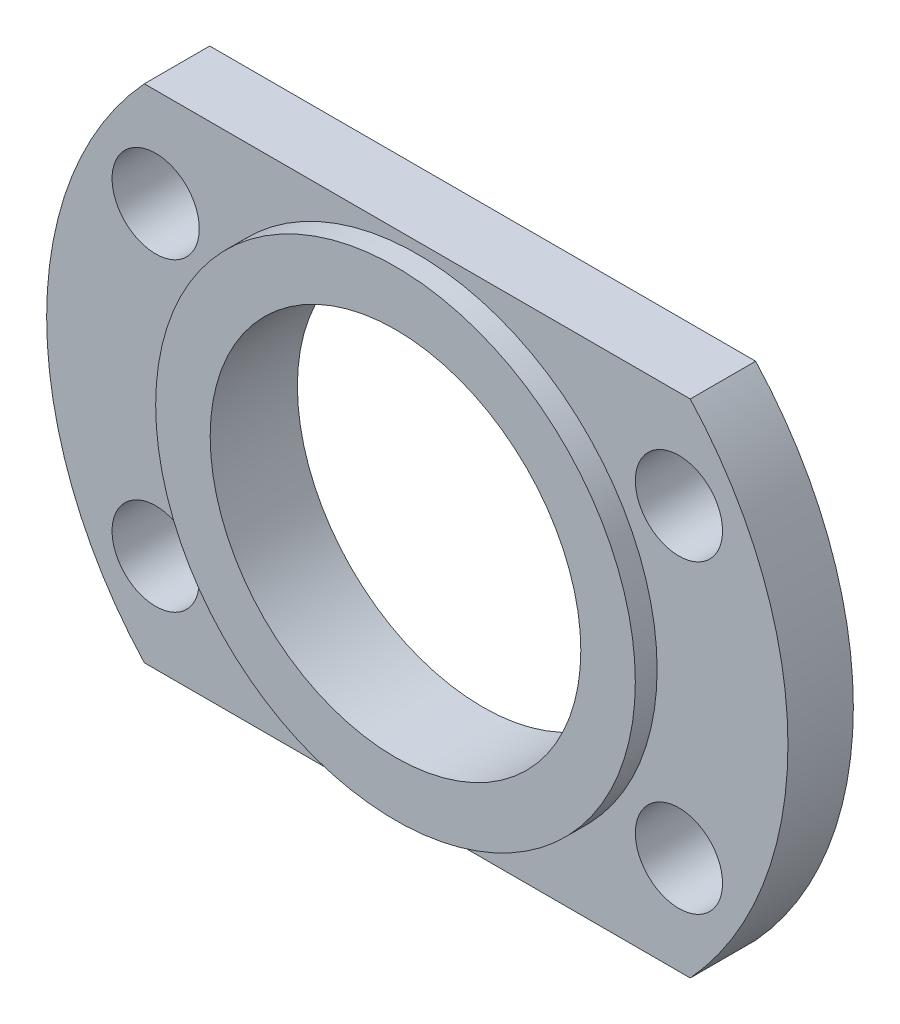
ISO-10303-21;
HEADER;
FILE_DESCRIPTION(('STEP AP214'),'2;1');
FILE_NAME('part.step','',(''),(''),'','','');
FILE_SCHEMA(('AUTOMOTIVE_DESIGN { 1 0 10303 214 1 1 1 1 }'));
ENDSEC;
DATA;
#1=APPLICATION_CONTEXT('core data for automotive mechanical design processes');
#2=APPLICATION_PROTOCOL_DEFINITION('international standard','automotive_design',2000,#1);
#3=PRODUCT_CONTEXT('',#1,'mechanical');
#4=PRODUCT('Part','Part','',(#3));
#5=PRODUCT_RELATED_PRODUCT_CATEGORY('part','',(#4));
#6=PRODUCT_DEFINITION_FORMATION('','',#4);
#7=PRODUCT_DEFINITION_CONTEXT('part definition',#1,'design');
#8=PRODUCT_DEFINITION('design','',#6,#7);
#9=PRODUCT_DEFINITION_SHAPE('','',#8);
#10=(LENGTH_UNIT() NAMED_UNIT(*) SI_UNIT(.MILLI.,.METRE.));
#11=(NAMED_UNIT(*) PLANE_ANGLE_UNIT() SI_UNIT($,.RADIAN.));
#12=(NAMED_UNIT(*) SI_UNIT($,.STERADIAN.) SOLID_ANGLE_UNIT());
#13=UNCERTAINTY_MEASURE_WITH_UNIT(LENGTH_MEASURE(1.E-05),#10,'distance_accuracy_value','');
#14=(GEOMETRIC_REPRESENTATION_CONTEXT(3) GLOBAL_UNCERTAINTY_ASSIGNED_CONTEXT((#13)) GLOBAL_UNIT_ASSIGNED_CONTEXT((#10,
#11,#12)) REPRESENTATION_CONTEXT('',''));
#15=CARTESIAN_POINT('',(0.,0.,0.));
#16=DIRECTION('',(0.,0.,1.));
#17=DIRECTION('',(1.,0.,0.));
#18=AXIS2_PLACEMENT_3D('',#15,#16,#17);
#19=CARTESIAN_POINT('',(0.,0.,3.));
#20=DIRECTION('',(0.,0.,1.));
#21=DIRECTION('',(1.,0.,0.));
#22=AXIS2_PLACEMENT_3D('',#19,#20,#21);
#23=PLANE('',#22);
#24=CARTESIAN_POINT('',(12.,7.,3.));
#25=DIRECTION('',(0.,0.,1.));
#26=DIRECTION('',(1.,0.,0.));
#27=AXIS2_PLACEMENT_3D('',#24,#25,#26);
#28=CIRCLE('',#27,2.);
#29=CARTESIAN_POINT('',(14.,7.,3.));
#30=VERTEX_POINT('',#29);
#31=EDGE_CURVE('E122',#30,#30,#28,.T.);
#32=ORIENTED_EDGE('',*,*,#31,.F.);
#33=EDGE_LOOP('',(#32));
#34=FACE_BOUND('',#33,.T.);
#35=CARTESIAN_POINT('',(-12.,-7.,3.));
#36=DIRECTION('',(0.,0.,1.));
#37=DIRECTION('',(1.,0.,0.));
#38=AXIS2_PLACEMENT_3D('',#35,#36,#37);
#39=CIRCLE('',#38,2.);
#40=CARTESIAN_POINT('',(-10.,-7.,3.));
#41=VERTEX_POINT('',#40);
#42=EDGE_CURVE('E101',#41,#41,#39,.T.);
#43=ORIENTED_EDGE('',*,*,#42,.F.);
#44=EDGE_LOOP('',(#43));
#45=FACE_BOUND('',#44,.T.);
#46=CARTESIAN_POINT('',(0.,0.,3.));
#47=DIRECTION('',(0.,0.,1.));
#48=DIRECTION('',(1.,0.,0.));
#49=AXIS2_PLACEMENT_3D('',#46,#47,#48);
#50=CIRCLE('',#49,17.);
#51=CARTESIAN_POINT('',(-12.5199840255489,11.5,3.));
#52=VERTEX_POINT('',#51);
#53=CARTESIAN_POINT('',(-12.5199840255489,-11.5,3.));
#54=VERTEX_POINT('',#53);
#55=EDGE_CURVE('E86',#52,#54,#50,.T.);
#56=ORIENTED_EDGE('',*,*,#55,.T.);
#57=DIRECTION('',(1.,0.,0.));
#58=VECTOR('',#57,1.);
#59=CARTESIAN_POINT('',(-12.5199840255489,-11.5,3.));
#60=LINE('',#59,#58);
#61=CARTESIAN_POINT('',(12.5199840255489,-11.5,3.));
#62=VERTEX_POINT('',#61);
#63=EDGE_CURVE('E81',#54,#62,#60,.T.);
#64=ORIENTED_EDGE('',*,*,#63,.T.);
#65=CARTESIAN_POINT('',(0.,0.,3.));
#66=DIRECTION('',(0.,0.,1.));
#67=DIRECTION('',(1.,0.,0.));
#68=AXIS2_PLACEMENT_3D('',#65,#66,#67);
#69=CIRCLE('',#68,17.);
#70=CARTESIAN_POINT('',(12.5199840255489,11.5,3.));
#71=VERTEX_POINT('',#70);
#72=EDGE_CURVE('E84',#62,#71,#69,.T.);
#73=ORIENTED_EDGE('',*,*,#72,.T.);
#74=DIRECTION('',(-1.,0.,0.));
#75=VECTOR('',#74,1.);
#76=CARTESIAN_POINT('',(-12.5199840255489,11.5,3.));
#77=LINE('',#76,#75);
#78=EDGE_CURVE('E51',#71,#52,#77,.T.);
#79=ORIENTED_EDGE('',*,*,#78,.T.);
#80=EDGE_LOOP('',(#56,#64,#73,#79));
#81=FACE_BOUND('',#80,.T.);
#82=CARTESIAN_POINT('',(-12.,7.,3.));
#83=DIRECTION('',(0.,0.,1.));
#84=DIRECTION('',(1.,0.,0.));
#85=AXIS2_PLACEMENT_3D('',#82,#83,#84);
#86=CIRCLE('',#85,2.);
#87=CARTESIAN_POINT('',(-10.,7.,3.));
#88=VERTEX_POINT('',#87);
#89=EDGE_CURVE('E116',#88,#88,#86,.T.);
#90=ORIENTED_EDGE('',*,*,#89,.F.);
#91=EDGE_LOOP('',(#90));
#92=FACE_BOUND('',#91,.T.);
#93=CARTESIAN_POINT('',(12.,-7.,3.));
#94=DIRECTION('',(0.,0.,1.));
#95=DIRECTION('',(1.,0.,0.));
#96=AXIS2_PLACEMENT_3D('',#93,#94,#95);
#97=CIRCLE('',#96,2.);
#98=CARTESIAN_POINT('',(14.,-7.,3.));
#99=VERTEX_POINT('',#98);
#100=EDGE_CURVE('E128',#99,#99,#97,.T.);
#101=ORIENTED_EDGE('',*,*,#100,.F.);
#102=EDGE_LOOP('',(#101));
#103=FACE_BOUND('',#102,.T.);
#104=CARTESIAN_POINT('',(0.,0.,3.));
#105=DIRECTION('',(0.,0.,1.));
#106=DIRECTION('',(1.,0.,0.));
#107=AXIS2_PLACEMENT_3D('',#104,#105,#106);
#108=CIRCLE('',#107,11.);
#109=CARTESIAN_POINT('',(11.,0.,3.));
#110=VERTEX_POINT('',#109);
#111=EDGE_CURVE('E140',#110,#110,#108,.T.);
#112=ORIENTED_EDGE('',*,*,#111,.F.);
#113=EDGE_LOOP('',(#112));
#114=FACE_BOUND('',#113,.T.);
#115=ADVANCED_FACE('F34',(#34,#45,#81,#92,#103,#114),#23,.T.);
#116=CARTESIAN_POINT('',(0.,0.,0.));
#117=DIRECTION('',(0.,0.,1.));
#118=DIRECTION('',(1.,0.,0.));
#119=AXIS2_PLACEMENT_3D('',#116,#117,#118);
#120=PLANE('',#119);
#121=CARTESIAN_POINT('',(12.,-7.,0.));
#122=DIRECTION('',(0.,0.,1.));
#123=DIRECTION('',(1.,0.,0.));
#124=AXIS2_PLACEMENT_3D('',#121,#122,#123);
#125=CIRCLE('',#124,2.);
#126=CARTESIAN_POINT('',(14.,-7.,0.));
#127=VERTEX_POINT('',#126);
#128=EDGE_CURVE('E131',#127,#127,#125,.T.);
#129=ORIENTED_EDGE('',*,*,#128,.T.);
#130=EDGE_LOOP('',(#129));
#131=FACE_BOUND('',#130,.T.);
#132=CARTESIAN_POINT('',(-12.,7.,0.));
#133=DIRECTION('',(0.,0.,1.));
#134=DIRECTION('',(1.,0.,0.));
#135=AXIS2_PLACEMENT_3D('',#132,#133,#134);
#136=CIRCLE('',#135,2.);
#137=CARTESIAN_POINT('',(-10.,7.,0.));
#138=VERTEX_POINT('',#137);
#139=EDGE_CURVE('E119',#138,#138,#136,.T.);
#140=ORIENTED_EDGE('',*,*,#139,.T.);
#141=EDGE_LOOP('',(#140));
#142=FACE_BOUND('',#141,.T.);
#143=CARTESIAN_POINT('',(0.,0.,0.));
#144=DIRECTION('',(0.,0.,1.));
#145=DIRECTION('',(1.,0.,0.));
#146=AXIS2_PLACEMENT_3D('',#143,#144,#145);
#147=CIRCLE('',#146,17.);
#148=CARTESIAN_POINT('',(-12.5199840255489,11.5,0.));
#149=VERTEX_POINT('',#148);
#150=CARTESIAN_POINT('',(-12.5199840255489,-11.5,0.));
#151=VERTEX_POINT('',#150);
#152=EDGE_CURVE('E98',#149,#151,#147,.T.);
#153=ORIENTED_EDGE('',*,*,#152,.F.);
#154=DIRECTION('',(-1.,0.,0.));
#155=VECTOR('',#154,1.);
#156=CARTESIAN_POINT('',(-12.5199840255489,11.5,0.));
#157=LINE('',#156,#155);
#158=CARTESIAN_POINT('',(12.5199840255489,11.5,0.));
#159=VERTEX_POINT('',#158);
#160=EDGE_CURVE('E74',#159,#149,#157,.T.);
#161=ORIENTED_EDGE('',*,*,#160,.F.);
#162=CARTESIAN_POINT('',(0.,0.,0.));
#163=DIRECTION('',(0.,0.,1.));
#164=DIRECTION('',(1.,0.,0.));
#165=AXIS2_PLACEMENT_3D('',#162,#163,#164);
#166=CIRCLE('',#165,17.);
#167=CARTESIAN_POINT('',(12.5199840255489,-11.5,0.));
#168=VERTEX_POINT('',#167);
#169=EDGE_CURVE('E68',#168,#159,#166,.T.);
#170=ORIENTED_EDGE('',*,*,#169,.F.);
#171=DIRECTION('',(1.,0.,0.));
#172=VECTOR('',#171,1.);
#173=CARTESIAN_POINT('',(-12.5199840255489,-11.5,0.));
#174=LINE('',#173,#172);
#175=EDGE_CURVE('E90',#151,#168,#174,.T.);
#176=ORIENTED_EDGE('',*,*,#175,.F.);
#177=EDGE_LOOP('',(#153,#161,#170,#176));
#178=FACE_BOUND('',#177,.T.);
#179=CARTESIAN_POINT('',(-12.,-7.,0.));
#180=DIRECTION('',(0.,0.,1.));
#181=DIRECTION('',(1.,0.,0.));
#182=AXIS2_PLACEMENT_3D('',#179,#180,#181);
#183=CIRCLE('',#182,2.);
#184=CARTESIAN_POINT('',(-10.,-7.,0.));
#185=VERTEX_POINT('',#184);
#186=EDGE_CURVE('E113',#185,#185,#183,.T.);
#187=ORIENTED_EDGE('',*,*,#186,.T.);
#188=EDGE_LOOP('',(#187));
#189=FACE_BOUND('',#188,.T.);
#190=CARTESIAN_POINT('',(12.,7.,0.));
#191=DIRECTION('',(0.,0.,1.));
#192=DIRECTION('',(1.,0.,0.));
#193=AXIS2_PLACEMENT_3D('',#190,#191,#192);
#194=CIRCLE('',#193,2.);
#195=CARTESIAN_POINT('',(14.,7.,0.));
#196=VERTEX_POINT('',#195);
#197=EDGE_CURVE('E125',#196,#196,#194,.T.);
#198=ORIENTED_EDGE('',*,*,#197,.T.);
#199=EDGE_LOOP('',(#198));
#200=FACE_BOUND('',#199,.T.);
#201=CARTESIAN_POINT('',(0.,0.,0.));
#202=DIRECTION('',(0.,0.,1.));
#203=DIRECTION('',(1.,0.,0.));
#204=AXIS2_PLACEMENT_3D('',#201,#202,#203);
#205=CIRCLE('',#204,8.5);
#206=CARTESIAN_POINT('',(8.5,0.,0.));
#207=VERTEX_POINT('',#206);
#208=EDGE_CURVE('E134',#207,#207,#205,.T.);
#209=ORIENTED_EDGE('',*,*,#208,.T.);
#210=EDGE_LOOP('',(#209));
#211=FACE_BOUND('',#210,.T.);
#212=ADVANCED_FACE('F109',(#131,#142,#178,#189,#200,#211),#120,.F.);
#213=CARTESIAN_POINT('',(0.,0.,3.));
#214=DIRECTION('',(0.,0.,-1.));
#215=DIRECTION('',(-1.,0.,0.));
#216=AXIS2_PLACEMENT_3D('',#213,#214,#215);
#217=CYLINDRICAL_SURFACE('',#216,17.);
#218=ORIENTED_EDGE('',*,*,#152,.T.);
#219=DIRECTION('',(0.,0.,-1.));
#220=VECTOR('',#219,1.);
#221=CARTESIAN_POINT('',(-12.5199840255489,-11.5,3.));
#222=LINE('',#221,#220);
#223=EDGE_CURVE('E11',#54,#151,#222,.T.);
#224=ORIENTED_EDGE('',*,*,#223,.F.);
#225=ORIENTED_EDGE('',*,*,#55,.F.);
#226=DIRECTION('',(0.,0.,-1.));
#227=VECTOR('',#226,1.);
#228=CARTESIAN_POINT('',(-12.5199840255489,11.5,3.));
#229=LINE('',#228,#227);
#230=EDGE_CURVE('E94',#52,#149,#229,.T.);
#231=ORIENTED_EDGE('',*,*,#230,.T.);
#232=EDGE_LOOP('',(#218,#224,#225,#231));
#233=FACE_BOUND('',#232,.T.);
#234=ADVANCED_FACE('F36',(#233),#217,.T.);
#235=CARTESIAN_POINT('',(-12.5199840255489,-11.5,3.));
#236=DIRECTION('',(0.,1.,0.));
#237=DIRECTION('',(0.,0.,1.));
#238=AXIS2_PLACEMENT_3D('',#235,#236,#237);
#239=PLANE('',#238);
#240=ORIENTED_EDGE('',*,*,#175,.T.);
#241=DIRECTION('',(0.,0.,-1.));
#242=VECTOR('',#241,1.);
#243=CARTESIAN_POINT('',(12.5199840255489,-11.5,3.));
#244=LINE('',#243,#242);
#245=EDGE_CURVE('E43',#62,#168,#244,.T.);
#246=ORIENTED_EDGE('',*,*,#245,.F.);
#247=ORIENTED_EDGE('',*,*,#63,.F.);
#248=ORIENTED_EDGE('',*,*,#223,.T.);
#249=EDGE_LOOP('',(#240,#246,#247,#248));
#250=FACE_BOUND('',#249,.T.);
#251=ADVANCED_FACE('F89',(#250),#239,.F.);
#252=CARTESIAN_POINT('',(0.,0.,3.));
#253=DIRECTION('',(0.,0.,-1.));
#254=DIRECTION('',(-1.,0.,0.));
#255=AXIS2_PLACEMENT_3D('',#252,#253,#254);
#256=CYLINDRICAL_SURFACE('',#255,17.);
#257=ORIENTED_EDGE('',*,*,#169,.T.);
#258=DIRECTION('',(0.,0.,-1.));
#259=VECTOR('',#258,1.);
#260=CARTESIAN_POINT('',(12.5199840255489,11.5,3.));
#261=LINE('',#260,#259);
#262=EDGE_CURVE('E91',#71,#159,#261,.T.);
#263=ORIENTED_EDGE('',*,*,#262,.F.);
#264=ORIENTED_EDGE('',*,*,#72,.F.);
#265=ORIENTED_EDGE('',*,*,#245,.T.);
#266=EDGE_LOOP('',(#257,#263,#264,#265));
#267=FACE_BOUND('',#266,.T.);
#268=ADVANCED_FACE('F92',(#267),#256,.T.);
#269=CARTESIAN_POINT('',(-12.5199840255489,11.5,3.));
#270=DIRECTION('',(0.,-1.,0.));
#271=DIRECTION('',(0.,0.,-1.));
#272=AXIS2_PLACEMENT_3D('',#269,#270,#271);
#273=PLANE('',#272);
#274=ORIENTED_EDGE('',*,*,#160,.T.);
#275=ORIENTED_EDGE('',*,*,#230,.F.);
#276=ORIENTED_EDGE('',*,*,#78,.F.);
#277=ORIENTED_EDGE('',*,*,#262,.T.);
#278=EDGE_LOOP('',(#274,#275,#276,#277));
#279=FACE_BOUND('',#278,.T.);
#280=ADVANCED_FACE('F106',(#279),#273,.F.);
#281=CARTESIAN_POINT('',(-12.,-7.,3.));
#282=DIRECTION('',(0.,0.,-1.));
#283=DIRECTION('',(-1.,0.,0.));
#284=AXIS2_PLACEMENT_3D('',#281,#282,#283);
#285=CYLINDRICAL_SURFACE('',#284,2.);
#286=ORIENTED_EDGE('',*,*,#42,.T.);
#287=EDGE_LOOP('',(#286));
#288=FACE_BOUND('',#287,.T.);
#289=ORIENTED_EDGE('',*,*,#186,.F.);
#290=EDGE_LOOP('',(#289));
#291=FACE_BOUND('',#290,.T.);
#292=ADVANCED_FACE('F176',(#288,#291),#285,.F.);
#293=CARTESIAN_POINT('',(-12.,7.,3.));
#294=DIRECTION('',(0.,0.,-1.));
#295=DIRECTION('',(-1.,0.,0.));
#296=AXIS2_PLACEMENT_3D('',#293,#294,#295);
#297=CYLINDRICAL_SURFACE('',#296,2.);
#298=ORIENTED_EDGE('',*,*,#89,.T.);
#299=EDGE_LOOP('',(#298));
#300=FACE_BOUND('',#299,.T.);
#301=ORIENTED_EDGE('',*,*,#139,.F.);
#302=EDGE_LOOP('',(#301));
#303=FACE_BOUND('',#302,.T.);
#304=ADVANCED_FACE('F218',(#300,#303),#297,.F.);
#305=CARTESIAN_POINT('',(12.,7.,3.));
#306=DIRECTION('',(0.,0.,-1.));
#307=DIRECTION('',(-1.,0.,0.));
#308=AXIS2_PLACEMENT_3D('',#305,#306,#307);
#309=CYLINDRICAL_SURFACE('',#308,2.);
#310=ORIENTED_EDGE('',*,*,#31,.T.);
#311=EDGE_LOOP('',(#310));
#312=FACE_BOUND('',#311,.T.);
#313=ORIENTED_EDGE('',*,*,#197,.F.);
#314=EDGE_LOOP('',(#313));
#315=FACE_BOUND('',#314,.T.);
#316=ADVANCED_FACE('F226',(#312,#315),#309,.F.);
#317=CARTESIAN_POINT('',(12.,-7.,3.));
#318=DIRECTION('',(0.,0.,-1.));
#319=DIRECTION('',(-1.,0.,0.));
#320=AXIS2_PLACEMENT_3D('',#317,#318,#319);
#321=CYLINDRICAL_SURFACE('',#320,2.);
#322=ORIENTED_EDGE('',*,*,#100,.T.);
#323=EDGE_LOOP('',(#322));
#324=FACE_BOUND('',#323,.T.);
#325=ORIENTED_EDGE('',*,*,#128,.F.);
#326=EDGE_LOOP('',(#325));
#327=FACE_BOUND('',#326,.T.);
#328=ADVANCED_FACE('F162',(#324,#327),#321,.F.);
#329=CARTESIAN_POINT('',(0.,0.,3.));
#330=DIRECTION('',(0.,0.,-1.));
#331=DIRECTION('',(-1.,0.,0.));
#332=AXIS2_PLACEMENT_3D('',#329,#330,#331);
#333=CYLINDRICAL_SURFACE('',#332,8.5);
#334=ORIENTED_EDGE('',*,*,#208,.F.);
#335=EDGE_LOOP('',(#334));
#336=FACE_BOUND('',#335,.T.);
#337=CARTESIAN_POINT('',(0.,0.,4.));
#338=DIRECTION('',(0.,0.,1.));
#339=DIRECTION('',(1.,0.,0.));
#340=AXIS2_PLACEMENT_3D('',#337,#338,#339);
#341=CIRCLE('',#340,8.5);
#342=CARTESIAN_POINT('',(8.5,0.,4.));
#343=VERTEX_POINT('',#342);
#344=EDGE_CURVE('E143',#343,#343,#341,.T.);
#345=ORIENTED_EDGE('',*,*,#344,.T.);
#346=EDGE_LOOP('',(#345));
#347=FACE_BOUND('',#346,.T.);
#348=ADVANCED_FACE('F149',(#336,#347),#333,.F.);
#349=CARTESIAN_POINT('',(0.,0.,4.));
#350=DIRECTION('',(0.,0.,1.));
#351=DIRECTION('',(1.,0.,0.));
#352=AXIS2_PLACEMENT_3D('',#349,#350,#351);
#353=PLANE('',#352);
#354=CARTESIAN_POINT('',(0.,0.,4.));
#355=DIRECTION('',(0.,0.,1.));
#356=DIRECTION('',(1.,0.,0.));
#357=AXIS2_PLACEMENT_3D('',#354,#355,#356);
#358=CIRCLE('',#357,11.);
#359=CARTESIAN_POINT('',(11.,0.,4.));
#360=VERTEX_POINT('',#359);
#361=EDGE_CURVE('E139',#360,#360,#358,.T.);
#362=ORIENTED_EDGE('',*,*,#361,.T.);
#363=EDGE_LOOP('',(#362));
#364=FACE_BOUND('',#363,.T.);
#365=ORIENTED_EDGE('',*,*,#344,.F.);
#366=EDGE_LOOP('',(#365));
#367=FACE_BOUND('',#366,.T.);
#368=ADVANCED_FACE('F151',(#364,#367),#353,.T.);
#369=CARTESIAN_POINT('',(0.,0.,4.));
#370=DIRECTION('',(0.,0.,-1.));
#371=DIRECTION('',(-1.,0.,0.));
#372=AXIS2_PLACEMENT_3D('',#369,#370,#371);
#373=CYLINDRICAL_SURFACE('',#372,11.);
#374=ORIENTED_EDGE('',*,*,#361,.F.);
#375=EDGE_LOOP('',(#374));
#376=FACE_BOUND('',#375,.T.);
#377=ORIENTED_EDGE('',*,*,#111,.T.);
#378=EDGE_LOOP('',(#377));
#379=FACE_BOUND('',#378,.T.);
#380=ADVANCED_FACE('F153',(#376,#379),#373,.T.);
#381=CLOSED_SHELL('',(#115,#212,#234,#251,#268,#280,#292,#304,#316,#328,#348,#368,#380));
#382=MANIFOLD_SOLID_BREP('B2',#381);
#383=ADVANCED_BREP_SHAPE_REPRESENTATION('',(#18,#382),#14);
#384=SHAPE_DEFINITION_REPRESENTATION(#9,#383);
ENDSEC;
END-ISO-10303-21;
